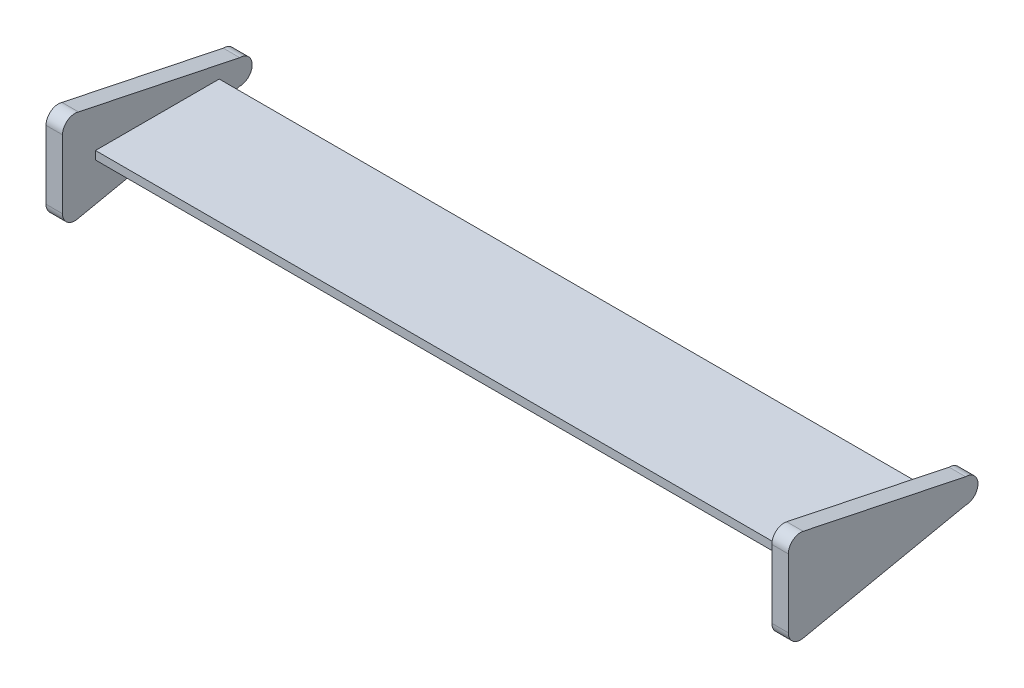
ISO-10303-21;
HEADER;
FILE_DESCRIPTION(('STEP AP214'),'2;1');
FILE_NAME('part.step','',(''),(''),'','','');
FILE_SCHEMA(('AUTOMOTIVE_DESIGN { 1 0 10303 214 1 1 1 1 }'));
ENDSEC;
DATA;
#1=APPLICATION_CONTEXT('core data for automotive mechanical design processes');
#2=APPLICATION_PROTOCOL_DEFINITION('international standard','automotive_design',2000,#1);
#3=PRODUCT_CONTEXT('',#1,'mechanical');
#4=PRODUCT('Part','Part','',(#3));
#5=PRODUCT_RELATED_PRODUCT_CATEGORY('part','',(#4));
#6=PRODUCT_DEFINITION_FORMATION('','',#4);
#7=PRODUCT_DEFINITION_CONTEXT('part definition',#1,'design');
#8=PRODUCT_DEFINITION('design','',#6,#7);
#9=PRODUCT_DEFINITION_SHAPE('','',#8);
#10=(LENGTH_UNIT() NAMED_UNIT(*) SI_UNIT(.MILLI.,.METRE.));
#11=(NAMED_UNIT(*) PLANE_ANGLE_UNIT() SI_UNIT($,.RADIAN.));
#12=(NAMED_UNIT(*) SI_UNIT($,.STERADIAN.) SOLID_ANGLE_UNIT());
#13=UNCERTAINTY_MEASURE_WITH_UNIT(LENGTH_MEASURE(1.E-05),#10,'distance_accuracy_value','');
#14=(GEOMETRIC_REPRESENTATION_CONTEXT(3) GLOBAL_UNCERTAINTY_ASSIGNED_CONTEXT((#13)) GLOBAL_UNIT_ASSIGNED_CONTEXT((#10,
#11,#12)) REPRESENTATION_CONTEXT('',''));
#15=CARTESIAN_POINT('',(0.,0.,0.));
#16=DIRECTION('',(0.,0.,1.));
#17=DIRECTION('',(1.,0.,0.));
#18=AXIS2_PLACEMENT_3D('',#15,#16,#17);
#19=CARTESIAN_POINT('',(-45.,0.5,-7.5));
#20=DIRECTION('',(0.,0.,1.));
#21=DIRECTION('',(1.,0.,0.));
#22=AXIS2_PLACEMENT_3D('',#19,#20,#21);
#23=PLANE('',#22);
#24=DIRECTION('',(0.,-1.,0.));
#25=VECTOR('',#24,1.);
#26=CARTESIAN_POINT('',(-43.,0.5,-7.5));
#27=LINE('',#26,#25);
#28=CARTESIAN_POINT('',(-43.,0.5,-7.5));
#29=VERTEX_POINT('',#28);
#30=CARTESIAN_POINT('',(-43.,-0.5,-7.5));
#31=VERTEX_POINT('',#30);
#32=EDGE_CURVE('E341',#29,#31,#27,.T.);
#33=ORIENTED_EDGE('',*,*,#32,.F.);
#34=DIRECTION('',(-1.,0.,0.));
#35=VECTOR('',#34,1.);
#36=CARTESIAN_POINT('',(-45.,0.5,-7.5));
#37=LINE('',#36,#35);
#38=CARTESIAN_POINT('',(43.,0.5,-7.5));
#39=VERTEX_POINT('',#38);
#40=EDGE_CURVE('E426',#39,#29,#37,.T.);
#41=ORIENTED_EDGE('',*,*,#40,.F.);
#42=DIRECTION('',(0.,1.,0.));
#43=VECTOR('',#42,1.);
#44=CARTESIAN_POINT('',(43.,0.5,-7.5));
#45=LINE('',#44,#43);
#46=CARTESIAN_POINT('',(43.,-0.5,-7.5));
#47=VERTEX_POINT('',#46);
#48=EDGE_CURVE('E418',#47,#39,#45,.T.);
#49=ORIENTED_EDGE('',*,*,#48,.F.);
#50=DIRECTION('',(-1.,0.,0.));
#51=VECTOR('',#50,1.);
#52=CARTESIAN_POINT('',(-45.,-0.5,-7.5));
#53=LINE('',#52,#51);
#54=EDGE_CURVE('E425',#47,#31,#53,.T.);
#55=ORIENTED_EDGE('',*,*,#54,.T.);
#56=EDGE_LOOP('',(#33,#41,#49,#55));
#57=FACE_BOUND('',#56,.T.);
#58=ADVANCED_FACE('F42',(#57),#23,.F.);
#59=CARTESIAN_POINT('',(-45.,0.5,7.5));
#60=DIRECTION('',(0.,0.,-1.));
#61=DIRECTION('',(-1.,0.,0.));
#62=AXIS2_PLACEMENT_3D('',#59,#60,#61);
#63=PLANE('',#62);
#64=DIRECTION('',(0.,1.,0.));
#65=VECTOR('',#64,1.);
#66=CARTESIAN_POINT('',(-43.,0.5,7.5));
#67=LINE('',#66,#65);
#68=CARTESIAN_POINT('',(-43.,-0.5,7.5));
#69=VERTEX_POINT('',#68);
#70=CARTESIAN_POINT('',(-43.,0.5,7.5));
#71=VERTEX_POINT('',#70);
#72=EDGE_CURVE('E323',#69,#71,#67,.T.);
#73=ORIENTED_EDGE('',*,*,#72,.F.);
#74=DIRECTION('',(1.,0.,0.));
#75=VECTOR('',#74,1.);
#76=CARTESIAN_POINT('',(-45.,-0.5,7.5));
#77=LINE('',#76,#75);
#78=CARTESIAN_POINT('',(43.,-0.5,7.5));
#79=VERTEX_POINT('',#78);
#80=EDGE_CURVE('E431',#69,#79,#77,.T.);
#81=ORIENTED_EDGE('',*,*,#80,.T.);
#82=DIRECTION('',(0.,-1.,0.));
#83=VECTOR('',#82,1.);
#84=CARTESIAN_POINT('',(43.,0.5,7.5));
#85=LINE('',#84,#83);
#86=CARTESIAN_POINT('',(43.,0.5,7.5));
#87=VERTEX_POINT('',#86);
#88=EDGE_CURVE('E400',#87,#79,#85,.T.);
#89=ORIENTED_EDGE('',*,*,#88,.F.);
#90=DIRECTION('',(1.,0.,0.));
#91=VECTOR('',#90,1.);
#92=CARTESIAN_POINT('',(-45.,0.5,7.5));
#93=LINE('',#92,#91);
#94=EDGE_CURVE('E430',#71,#87,#93,.T.);
#95=ORIENTED_EDGE('',*,*,#94,.F.);
#96=EDGE_LOOP('',(#73,#81,#89,#95));
#97=FACE_BOUND('',#96,.T.);
#98=ADVANCED_FACE('F487',(#97),#63,.F.);
#99=CARTESIAN_POINT('',(0.,0.5,0.));
#100=DIRECTION('',(0.,1.,0.));
#101=DIRECTION('',(0.,0.,1.));
#102=AXIS2_PLACEMENT_3D('',#99,#100,#101);
#103=PLANE('',#102);
#104=ORIENTED_EDGE('',*,*,#40,.T.);
#105=DIRECTION('',(0.,0.,1.));
#106=VECTOR('',#105,1.);
#107=CARTESIAN_POINT('',(-43.,0.5,0.));
#108=LINE('',#107,#106);
#109=EDGE_CURVE('E345',#29,#71,#108,.T.);
#110=ORIENTED_EDGE('',*,*,#109,.T.);
#111=ORIENTED_EDGE('',*,*,#94,.T.);
#112=DIRECTION('',(0.,0.,-1.));
#113=VECTOR('',#112,1.);
#114=CARTESIAN_POINT('',(43.,0.5,0.));
#115=LINE('',#114,#113);
#116=EDGE_CURVE('E422',#87,#39,#115,.T.);
#117=ORIENTED_EDGE('',*,*,#116,.T.);
#118=EDGE_LOOP('',(#104,#110,#111,#117));
#119=FACE_BOUND('',#118,.T.);
#120=ADVANCED_FACE('F492',(#119),#103,.T.);
#121=CARTESIAN_POINT('',(0.,-0.5,0.));
#122=DIRECTION('',(0.,1.,0.));
#123=DIRECTION('',(0.,0.,1.));
#124=AXIS2_PLACEMENT_3D('',#121,#122,#123);
#125=PLANE('',#124);
#126=DIRECTION('',(1.,0.,0.));
#127=VECTOR('',#126,1.);
#128=CARTESIAN_POINT('',(0.,-0.5,1.5));
#129=LINE('',#128,#127);
#130=CARTESIAN_POINT('',(-15.,-0.5,1.5));
#131=VERTEX_POINT('',#130);
#132=CARTESIAN_POINT('',(-12.,-0.5,1.5));
#133=VERTEX_POINT('',#132);
#134=EDGE_CURVE('E463',#131,#133,#129,.T.);
#135=ORIENTED_EDGE('',*,*,#134,.T.);
#136=DIRECTION('',(0.,0.,-1.));
#137=VECTOR('',#136,1.);
#138=CARTESIAN_POINT('',(-12.,-0.5,0.));
#139=LINE('',#138,#137);
#140=CARTESIAN_POINT('',(-12.,-0.5,-1.5));
#141=VERTEX_POINT('',#140);
#142=EDGE_CURVE('E11',#133,#141,#139,.T.);
#143=ORIENTED_EDGE('',*,*,#142,.T.);
#144=DIRECTION('',(-1.,0.,0.));
#145=VECTOR('',#144,1.);
#146=CARTESIAN_POINT('',(0.,-0.5,-1.5));
#147=LINE('',#146,#145);
#148=CARTESIAN_POINT('',(-15.,-0.5,-1.5));
#149=VERTEX_POINT('',#148);
#150=EDGE_CURVE('E51',#141,#149,#147,.T.);
#151=ORIENTED_EDGE('',*,*,#150,.T.);
#152=DIRECTION('',(0.,0.,1.));
#153=VECTOR('',#152,1.);
#154=CARTESIAN_POINT('',(-15.,-0.5,0.));
#155=LINE('',#154,#153);
#156=EDGE_CURVE('E466',#149,#131,#155,.T.);
#157=ORIENTED_EDGE('',*,*,#156,.T.);
#158=EDGE_LOOP('',(#135,#143,#151,#157));
#159=FACE_BOUND('',#158,.T.);
#160=DIRECTION('',(0.,0.,-1.));
#161=VECTOR('',#160,1.);
#162=CARTESIAN_POINT('',(15.,-0.5,0.));
#163=LINE('',#162,#161);
#164=CARTESIAN_POINT('',(15.,-0.5,1.5));
#165=VERTEX_POINT('',#164);
#166=CARTESIAN_POINT('',(15.,-0.5,-1.5));
#167=VERTEX_POINT('',#166);
#168=EDGE_CURVE('E447',#165,#167,#163,.T.);
#169=ORIENTED_EDGE('',*,*,#168,.T.);
#170=DIRECTION('',(-1.,0.,0.));
#171=VECTOR('',#170,1.);
#172=CARTESIAN_POINT('',(0.,-0.5,-1.5));
#173=LINE('',#172,#171);
#174=CARTESIAN_POINT('',(12.,-0.5,-1.5));
#175=VERTEX_POINT('',#174);
#176=EDGE_CURVE('E459',#167,#175,#173,.T.);
#177=ORIENTED_EDGE('',*,*,#176,.T.);
#178=DIRECTION('',(0.,0.,1.));
#179=VECTOR('',#178,1.);
#180=CARTESIAN_POINT('',(12.,-0.5,0.));
#181=LINE('',#180,#179);
#182=CARTESIAN_POINT('',(12.,-0.5,1.5));
#183=VERTEX_POINT('',#182);
#184=EDGE_CURVE('E455',#175,#183,#181,.T.);
#185=ORIENTED_EDGE('',*,*,#184,.T.);
#186=DIRECTION('',(1.,0.,0.));
#187=VECTOR('',#186,1.);
#188=CARTESIAN_POINT('',(0.,-0.5,1.5));
#189=LINE('',#188,#187);
#190=EDGE_CURVE('E451',#183,#165,#189,.T.);
#191=ORIENTED_EDGE('',*,*,#190,.T.);
#192=EDGE_LOOP('',(#169,#177,#185,#191));
#193=FACE_BOUND('',#192,.T.);
#194=DIRECTION('',(0.,0.,1.));
#195=VECTOR('',#194,1.);
#196=CARTESIAN_POINT('',(-43.,-0.5,0.));
#197=LINE('',#196,#195);
#198=EDGE_CURVE('E443',#31,#69,#197,.T.);
#199=ORIENTED_EDGE('',*,*,#198,.F.);
#200=ORIENTED_EDGE('',*,*,#54,.F.);
#201=DIRECTION('',(0.,0.,-1.));
#202=VECTOR('',#201,1.);
#203=CARTESIAN_POINT('',(43.,-0.5,0.));
#204=LINE('',#203,#202);
#205=EDGE_CURVE('E434',#79,#47,#204,.T.);
#206=ORIENTED_EDGE('',*,*,#205,.F.);
#207=ORIENTED_EDGE('',*,*,#80,.F.);
#208=EDGE_LOOP('',(#199,#200,#206,#207));
#209=FACE_BOUND('',#208,.T.);
#210=ADVANCED_FACE('F472',(#159,#193,#209),#125,.F.);
#211=CARTESIAN_POINT('',(43.,4.14213562373104,10.));
#212=DIRECTION('',(1.,0.,0.));
#213=DIRECTION('',(0.,0.,-1.));
#214=AXIS2_PLACEMENT_3D('',#211,#212,#213);
#215=CYLINDRICAL_SURFACE('',#214,1.5);
#216=CARTESIAN_POINT('',(45.,4.14213562373104,10.));
#217=DIRECTION('',(1.,0.,0.));
#218=DIRECTION('',(0.,0.,-1.));
#219=AXIS2_PLACEMENT_3D('',#216,#217,#218);
#220=CIRCLE('',#219,1.5);
#221=CARTESIAN_POINT('',(45.,5.61049188842883,9.69352018023567));
#222=VERTEX_POINT('',#221);
#223=CARTESIAN_POINT('',(45.,4.14213562373103,11.5));
#224=VERTEX_POINT('',#223);
#225=EDGE_CURVE('E348',#222,#224,#220,.T.);
#226=ORIENTED_EDGE('',*,*,#225,.F.);
#227=DIRECTION('',(1.,0.,0.));
#228=VECTOR('',#227,1.);
#229=CARTESIAN_POINT('',(43.,5.61049188842883,9.69352018023567));
#230=LINE('',#229,#228);
#231=CARTESIAN_POINT('',(43.,5.61049188842883,9.69352018023567));
#232=VERTEX_POINT('',#231);
#233=EDGE_CURVE('E397',#232,#222,#230,.T.);
#234=ORIENTED_EDGE('',*,*,#233,.F.);
#235=CARTESIAN_POINT('',(43.,4.14213562373104,10.));
#236=DIRECTION('',(1.,0.,0.));
#237=DIRECTION('',(0.,0.,-1.));
#238=AXIS2_PLACEMENT_3D('',#235,#236,#237);
#239=CIRCLE('',#238,1.5);
#240=CARTESIAN_POINT('',(43.,4.14213562373103,11.5));
#241=VERTEX_POINT('',#240);
#242=EDGE_CURVE('E349',#232,#241,#239,.T.);
#243=ORIENTED_EDGE('',*,*,#242,.T.);
#244=DIRECTION('',(1.,0.,0.));
#245=VECTOR('',#244,1.);
#246=CARTESIAN_POINT('',(43.,4.14213562373103,11.5));
#247=LINE('',#246,#245);
#248=EDGE_CURVE('E374',#241,#224,#247,.T.);
#249=ORIENTED_EDGE('',*,*,#248,.T.);
#250=EDGE_LOOP('',(#226,#234,#243,#249));
#251=FACE_BOUND('',#250,.T.);
#252=ADVANCED_FACE('F504',(#251),#215,.T.);
#253=CARTESIAN_POINT('',(43.,5.61049188842883,9.69352018023567));
#254=DIRECTION('',(0.,0.978904176465188,-0.204319879842889));
#255=DIRECTION('',(0.,0.204319879842889,0.978904176465188));
#256=AXIS2_PLACEMENT_3D('',#253,#254,#255);
#257=PLANE('',#256);
#258=DIRECTION('',(0.,0.204319879842889,0.978904176465188));
#259=VECTOR('',#258,1.);
#260=CARTESIAN_POINT('',(45.,5.61049188842883,9.69352018023567));
#261=LINE('',#260,#259);
#262=CARTESIAN_POINT('',(45.,1.5,-10.));
#263=VERTEX_POINT('',#262);
#264=EDGE_CURVE('E354',#263,#222,#261,.T.);
#265=ORIENTED_EDGE('',*,*,#264,.F.);
#266=DIRECTION('',(1.,0.,0.));
#267=VECTOR('',#266,1.);
#268=CARTESIAN_POINT('',(43.,1.5,-10.));
#269=LINE('',#268,#267);
#270=CARTESIAN_POINT('',(43.,1.5,-10.));
#271=VERTEX_POINT('',#270);
#272=EDGE_CURVE('E401',#271,#263,#269,.T.);
#273=ORIENTED_EDGE('',*,*,#272,.F.);
#274=DIRECTION('',(0.,0.204319879842889,0.978904176465188));
#275=VECTOR('',#274,1.);
#276=CARTESIAN_POINT('',(43.,5.61049188842883,9.69352018023567));
#277=LINE('',#276,#275);
#278=EDGE_CURVE('E370',#271,#232,#277,.T.);
#279=ORIENTED_EDGE('',*,*,#278,.T.);
#280=ORIENTED_EDGE('',*,*,#233,.T.);
#281=EDGE_LOOP('',(#265,#273,#279,#280));
#282=FACE_BOUND('',#281,.T.);
#283=ADVANCED_FACE('F510',(#282),#257,.T.);
#284=CARTESIAN_POINT('',(43.,0.,-10.));
#285=DIRECTION('',(1.,0.,0.));
#286=DIRECTION('',(0.,0.,-1.));
#287=AXIS2_PLACEMENT_3D('',#284,#285,#286);
#288=CYLINDRICAL_SURFACE('',#287,1.5);
#289=CARTESIAN_POINT('',(45.,0.,-10.));
#290=DIRECTION('',(1.,0.,0.));
#291=DIRECTION('',(0.,0.,-1.));
#292=AXIS2_PLACEMENT_3D('',#289,#290,#291);
#293=CIRCLE('',#292,1.5);
#294=CARTESIAN_POINT('',(45.,-1.5,-10.));
#295=VERTEX_POINT('',#294);
#296=EDGE_CURVE('E390',#295,#263,#293,.T.);
#297=ORIENTED_EDGE('',*,*,#296,.F.);
#298=DIRECTION('',(1.,0.,0.));
#299=VECTOR('',#298,1.);
#300=CARTESIAN_POINT('',(43.,-1.5,-10.));
#301=LINE('',#300,#299);
#302=CARTESIAN_POINT('',(43.,-1.5,-10.));
#303=VERTEX_POINT('',#302);
#304=EDGE_CURVE('E404',#303,#295,#301,.T.);
#305=ORIENTED_EDGE('',*,*,#304,.F.);
#306=CARTESIAN_POINT('',(43.,0.,-10.));
#307=DIRECTION('',(1.,0.,0.));
#308=DIRECTION('',(0.,0.,-1.));
#309=AXIS2_PLACEMENT_3D('',#306,#307,#308);
#310=CIRCLE('',#309,1.5);
#311=EDGE_CURVE('E366',#303,#271,#310,.T.);
#312=ORIENTED_EDGE('',*,*,#311,.T.);
#313=ORIENTED_EDGE('',*,*,#272,.T.);
#314=EDGE_LOOP('',(#297,#305,#312,#313));
#315=FACE_BOUND('',#314,.T.);
#316=ADVANCED_FACE('F524',(#315),#288,.T.);
#317=CARTESIAN_POINT('',(43.,-1.5,-10.));
#318=DIRECTION('',(0.,-0.97890417646519,-0.204319879842881));
#319=DIRECTION('',(0.,0.204319879842881,-0.97890417646519));
#320=AXIS2_PLACEMENT_3D('',#317,#318,#319);
#321=PLANE('',#320);
#322=DIRECTION('',(0.,0.204319879842881,-0.978904176465189));
#323=VECTOR('',#322,1.);
#324=CARTESIAN_POINT('',(45.,-1.5,-10.));
#325=LINE('',#324,#323);
#326=CARTESIAN_POINT('',(45.,-5.61049188842866,9.69352018023567));
#327=VERTEX_POINT('',#326);
#328=EDGE_CURVE('E386',#327,#295,#325,.T.);
#329=ORIENTED_EDGE('',*,*,#328,.F.);
#330=DIRECTION('',(1.,0.,0.));
#331=VECTOR('',#330,1.);
#332=CARTESIAN_POINT('',(43.,-5.61049188842866,9.69352018023567));
#333=LINE('',#332,#331);
#334=CARTESIAN_POINT('',(43.,-5.61049188842866,9.69352018023567));
#335=VERTEX_POINT('',#334);
#336=EDGE_CURVE('E407',#335,#327,#333,.T.);
#337=ORIENTED_EDGE('',*,*,#336,.F.);
#338=DIRECTION('',(0.,0.204319879842881,-0.978904176465189));
#339=VECTOR('',#338,1.);
#340=CARTESIAN_POINT('',(43.,-1.5,-10.));
#341=LINE('',#340,#339);
#342=EDGE_CURVE('E362',#335,#303,#341,.T.);
#343=ORIENTED_EDGE('',*,*,#342,.T.);
#344=ORIENTED_EDGE('',*,*,#304,.T.);
#345=EDGE_LOOP('',(#329,#337,#343,#344));
#346=FACE_BOUND('',#345,.T.);
#347=ADVANCED_FACE('F520',(#346),#321,.T.);
#348=CARTESIAN_POINT('',(43.,-4.14213562373088,10.));
#349=DIRECTION('',(1.,0.,0.));
#350=DIRECTION('',(0.,0.,-1.));
#351=AXIS2_PLACEMENT_3D('',#348,#349,#350);
#352=CYLINDRICAL_SURFACE('',#351,1.5);
#353=CARTESIAN_POINT('',(45.,-4.14213562373088,10.));
#354=DIRECTION('',(1.,0.,0.));
#355=DIRECTION('',(0.,0.,-1.));
#356=AXIS2_PLACEMENT_3D('',#353,#354,#355);
#357=CIRCLE('',#356,1.5);
#358=CARTESIAN_POINT('',(45.,-4.14213562373089,11.5));
#359=VERTEX_POINT('',#358);
#360=EDGE_CURVE('E382',#359,#327,#357,.T.);
#361=ORIENTED_EDGE('',*,*,#360,.F.);
#362=DIRECTION('',(1.,0.,0.));
#363=VECTOR('',#362,1.);
#364=CARTESIAN_POINT('',(43.,-4.14213562373089,11.5));
#365=LINE('',#364,#363);
#366=CARTESIAN_POINT('',(43.,-4.14213562373089,11.5));
#367=VERTEX_POINT('',#366);
#368=EDGE_CURVE('E410',#367,#359,#365,.T.);
#369=ORIENTED_EDGE('',*,*,#368,.F.);
#370=CARTESIAN_POINT('',(43.,-4.14213562373088,10.));
#371=DIRECTION('',(1.,0.,0.));
#372=DIRECTION('',(0.,0.,-1.));
#373=AXIS2_PLACEMENT_3D('',#370,#371,#372);
#374=CIRCLE('',#373,1.5);
#375=EDGE_CURVE('E358',#367,#335,#374,.T.);
#376=ORIENTED_EDGE('',*,*,#375,.T.);
#377=ORIENTED_EDGE('',*,*,#336,.T.);
#378=EDGE_LOOP('',(#361,#369,#376,#377));
#379=FACE_BOUND('',#378,.T.);
#380=ADVANCED_FACE('F516',(#379),#352,.T.);
#381=CARTESIAN_POINT('',(43.,4.14213562373103,11.5));
#382=DIRECTION('',(0.,0.,1.));
#383=DIRECTION('',(0.,-1.,0.));
#384=AXIS2_PLACEMENT_3D('',#381,#382,#383);
#385=PLANE('',#384);
#386=DIRECTION('',(0.,-1.,0.));
#387=VECTOR('',#386,1.);
#388=CARTESIAN_POINT('',(45.,4.14213562373103,11.5));
#389=LINE('',#388,#387);
#390=EDGE_CURVE('E378',#224,#359,#389,.T.);
#391=ORIENTED_EDGE('',*,*,#390,.F.);
#392=ORIENTED_EDGE('',*,*,#248,.F.);
#393=DIRECTION('',(0.,-1.,0.));
#394=VECTOR('',#393,1.);
#395=CARTESIAN_POINT('',(43.,4.14213562373103,11.5));
#396=LINE('',#395,#394);
#397=EDGE_CURVE('E353',#241,#367,#396,.T.);
#398=ORIENTED_EDGE('',*,*,#397,.T.);
#399=ORIENTED_EDGE('',*,*,#368,.T.);
#400=EDGE_LOOP('',(#391,#392,#398,#399));
#401=FACE_BOUND('',#400,.T.);
#402=ADVANCED_FACE('F512',(#401),#385,.T.);
#403=CARTESIAN_POINT('',(43.,4.14213562373104,10.));
#404=DIRECTION('',(1.,0.,0.));
#405=DIRECTION('',(0.,0.,-1.));
#406=AXIS2_PLACEMENT_3D('',#403,#404,#405);
#407=PLANE('',#406);
#408=ORIENTED_EDGE('',*,*,#116,.F.);
#409=ORIENTED_EDGE('',*,*,#88,.T.);
#410=ORIENTED_EDGE('',*,*,#205,.T.);
#411=ORIENTED_EDGE('',*,*,#48,.T.);
#412=EDGE_LOOP('',(#408,#409,#410,#411));
#413=FACE_BOUND('',#412,.T.);
#414=ORIENTED_EDGE('',*,*,#242,.F.);
#415=ORIENTED_EDGE('',*,*,#278,.F.);
#416=ORIENTED_EDGE('',*,*,#311,.F.);
#417=ORIENTED_EDGE('',*,*,#342,.F.);
#418=ORIENTED_EDGE('',*,*,#375,.F.);
#419=ORIENTED_EDGE('',*,*,#397,.F.);
#420=EDGE_LOOP('',(#414,#415,#416,#417,#418,#419));
#421=FACE_BOUND('',#420,.T.);
#422=ADVANCED_FACE('F515',(#413,#421),#407,.F.);
#423=CARTESIAN_POINT('',(45.,0.5,-7.5));
#424=DIRECTION('',(-1.,0.,0.));
#425=DIRECTION('',(0.,0.,1.));
#426=AXIS2_PLACEMENT_3D('',#423,#424,#425);
#427=PLANE('',#426);
#428=ORIENTED_EDGE('',*,*,#225,.T.);
#429=ORIENTED_EDGE('',*,*,#390,.T.);
#430=ORIENTED_EDGE('',*,*,#360,.T.);
#431=ORIENTED_EDGE('',*,*,#328,.T.);
#432=ORIENTED_EDGE('',*,*,#296,.T.);
#433=ORIENTED_EDGE('',*,*,#264,.T.);
#434=EDGE_LOOP('',(#428,#429,#430,#431,#432,#433));
#435=FACE_BOUND('',#434,.T.);
#436=ADVANCED_FACE('F44',(#435),#427,.F.);
#437=CARTESIAN_POINT('',(-43.,0.,-10.));
#438=DIRECTION('',(-1.,0.,0.));
#439=DIRECTION('',(0.,0.,1.));
#440=AXIS2_PLACEMENT_3D('',#437,#438,#439);
#441=CYLINDRICAL_SURFACE('',#440,1.5);
#442=CARTESIAN_POINT('',(-45.,0.,-10.));
#443=DIRECTION('',(-1.,0.,0.));
#444=DIRECTION('',(0.,0.,1.));
#445=AXIS2_PLACEMENT_3D('',#442,#443,#444);
#446=CIRCLE('',#445,1.5);
#447=CARTESIAN_POINT('',(-45.,1.5,-10.));
#448=VERTEX_POINT('',#447);
#449=CARTESIAN_POINT('',(-45.,-1.5,-10.));
#450=VERTEX_POINT('',#449);
#451=EDGE_CURVE('E240',#448,#450,#446,.T.);
#452=ORIENTED_EDGE('',*,*,#451,.F.);
#453=DIRECTION('',(-1.,0.,0.));
#454=VECTOR('',#453,1.);
#455=CARTESIAN_POINT('',(-43.,1.5,-10.));
#456=LINE('',#455,#454);
#457=CARTESIAN_POINT('',(-43.,1.5,-10.));
#458=VERTEX_POINT('',#457);
#459=EDGE_CURVE('E320',#458,#448,#456,.T.);
#460=ORIENTED_EDGE('',*,*,#459,.F.);
#461=CARTESIAN_POINT('',(-43.,0.,-10.));
#462=DIRECTION('',(-1.,0.,0.));
#463=DIRECTION('',(0.,0.,1.));
#464=AXIS2_PLACEMENT_3D('',#461,#462,#463);
#465=CIRCLE('',#464,1.5);
#466=CARTESIAN_POINT('',(-43.,-1.5,-10.));
#467=VERTEX_POINT('',#466);
#468=EDGE_CURVE('E272',#458,#467,#465,.T.);
#469=ORIENTED_EDGE('',*,*,#468,.T.);
#470=DIRECTION('',(-1.,0.,0.));
#471=VECTOR('',#470,1.);
#472=CARTESIAN_POINT('',(-43.,-1.5,-10.));
#473=LINE('',#472,#471);
#474=EDGE_CURVE('E297',#467,#450,#473,.T.);
#475=ORIENTED_EDGE('',*,*,#474,.T.);
#476=EDGE_LOOP('',(#452,#460,#469,#475));
#477=FACE_BOUND('',#476,.T.);
#478=ADVANCED_FACE('F535',(#477),#441,.T.);
#479=CARTESIAN_POINT('',(-43.,1.5,-10.));
#480=DIRECTION('',(0.,0.978975416046563,-0.203978270353633));
#481=DIRECTION('',(0.,0.203978270353633,0.978975416046562));
#482=AXIS2_PLACEMENT_3D('',#479,#480,#481);
#483=PLANE('',#482);
#484=DIRECTION('',(0.,-0.203978270353633,-0.978975416046562));
#485=VECTOR('',#484,1.);
#486=CARTESIAN_POINT('',(-45.,1.5,-10.));
#487=LINE('',#486,#485);
#488=CARTESIAN_POINT('',(-45.,5.57415826096195,9.55355720807899));
#489=VERTEX_POINT('',#488);
#490=EDGE_CURVE('E277',#489,#448,#487,.T.);
#491=ORIENTED_EDGE('',*,*,#490,.F.);
#492=DIRECTION('',(-1.,0.,0.));
#493=VECTOR('',#492,1.);
#494=CARTESIAN_POINT('',(-43.,5.57415826096195,9.55355720807899));
#495=LINE('',#494,#493);
#496=CARTESIAN_POINT('',(-43.,5.57415826096195,9.55355720807899));
#497=VERTEX_POINT('',#496);
#498=EDGE_CURVE('E324',#497,#489,#495,.T.);
#499=ORIENTED_EDGE('',*,*,#498,.F.);
#500=DIRECTION('',(0.,-0.203978270353633,-0.978975416046562));
#501=VECTOR('',#500,1.);
#502=CARTESIAN_POINT('',(-43.,1.5,-10.));
#503=LINE('',#502,#501);
#504=EDGE_CURVE('E293',#497,#458,#503,.T.);
#505=ORIENTED_EDGE('',*,*,#504,.T.);
#506=ORIENTED_EDGE('',*,*,#459,.T.);
#507=EDGE_LOOP('',(#491,#499,#505,#506));
#508=FACE_BOUND('',#507,.T.);
#509=ADVANCED_FACE('F538',(#508),#483,.T.);
#510=CARTESIAN_POINT('',(-43.,4.14213562373104,10.));
#511=DIRECTION('',(-1.,0.,0.));
#512=DIRECTION('',(0.,0.,1.));
#513=AXIS2_PLACEMENT_3D('',#510,#511,#512);
#514=CYLINDRICAL_SURFACE('',#513,1.5);
#515=CARTESIAN_POINT('',(-45.,4.14213562373104,10.));
#516=DIRECTION('',(-1.,0.,0.));
#517=DIRECTION('',(0.,0.,1.));
#518=AXIS2_PLACEMENT_3D('',#515,#516,#517);
#519=CIRCLE('',#518,1.5);
#520=CARTESIAN_POINT('',(-45.,4.14213562373104,11.5));
#521=VERTEX_POINT('',#520);
#522=EDGE_CURVE('E313',#521,#489,#519,.T.);
#523=ORIENTED_EDGE('',*,*,#522,.F.);
#524=DIRECTION('',(-1.,0.,0.));
#525=VECTOR('',#524,1.);
#526=CARTESIAN_POINT('',(-43.,4.14213562373104,11.5));
#527=LINE('',#526,#525);
#528=CARTESIAN_POINT('',(-43.,4.14213562373104,11.5));
#529=VERTEX_POINT('',#528);
#530=EDGE_CURVE('E327',#529,#521,#527,.T.);
#531=ORIENTED_EDGE('',*,*,#530,.F.);
#532=CARTESIAN_POINT('',(-43.,4.14213562373104,10.));
#533=DIRECTION('',(-1.,0.,0.));
#534=DIRECTION('',(0.,0.,1.));
#535=AXIS2_PLACEMENT_3D('',#532,#533,#534);
#536=CIRCLE('',#535,1.5);
#537=EDGE_CURVE('E289',#529,#497,#536,.T.);
#538=ORIENTED_EDGE('',*,*,#537,.T.);
#539=ORIENTED_EDGE('',*,*,#498,.T.);
#540=EDGE_LOOP('',(#523,#531,#538,#539));
#541=FACE_BOUND('',#540,.T.);
#542=ADVANCED_FACE('F551',(#541),#514,.T.);
#543=CARTESIAN_POINT('',(-43.,4.14213562373104,11.5));
#544=DIRECTION('',(0.,0.,1.));
#545=DIRECTION('',(0.,-1.,0.));
#546=AXIS2_PLACEMENT_3D('',#543,#544,#545);
#547=PLANE('',#546);
#548=DIRECTION('',(0.,1.,0.));
#549=VECTOR('',#548,1.);
#550=CARTESIAN_POINT('',(-45.,4.14213562373104,11.5));
#551=LINE('',#550,#549);
#552=CARTESIAN_POINT('',(-45.,-4.14213562373088,11.5));
#553=VERTEX_POINT('',#552);
#554=EDGE_CURVE('E309',#553,#521,#551,.T.);
#555=ORIENTED_EDGE('',*,*,#554,.F.);
#556=DIRECTION('',(-1.,0.,0.));
#557=VECTOR('',#556,1.);
#558=CARTESIAN_POINT('',(-43.,-4.14213562373088,11.5));
#559=LINE('',#558,#557);
#560=CARTESIAN_POINT('',(-43.,-4.14213562373088,11.5));
#561=VERTEX_POINT('',#560);
#562=EDGE_CURVE('E330',#561,#553,#559,.T.);
#563=ORIENTED_EDGE('',*,*,#562,.F.);
#564=DIRECTION('',(0.,1.,0.));
#565=VECTOR('',#564,1.);
#566=CARTESIAN_POINT('',(-43.,4.14213562373104,11.5));
#567=LINE('',#566,#565);
#568=EDGE_CURVE('E285',#561,#529,#567,.T.);
#569=ORIENTED_EDGE('',*,*,#568,.T.);
#570=ORIENTED_EDGE('',*,*,#530,.T.);
#571=EDGE_LOOP('',(#555,#563,#569,#570));
#572=FACE_BOUND('',#571,.T.);
#573=ADVANCED_FACE('F547',(#572),#547,.T.);
#574=CARTESIAN_POINT('',(-43.,-4.14213562373088,10.));
#575=DIRECTION('',(-1.,0.,0.));
#576=DIRECTION('',(0.,0.,1.));
#577=AXIS2_PLACEMENT_3D('',#574,#575,#576);
#578=CYLINDRICAL_SURFACE('',#577,1.5);
#579=CARTESIAN_POINT('',(-45.,-4.14213562373088,10.));
#580=DIRECTION('',(-1.,0.,0.));
#581=DIRECTION('',(0.,0.,1.));
#582=AXIS2_PLACEMENT_3D('',#579,#580,#581);
#583=CIRCLE('',#582,1.5);
#584=CARTESIAN_POINT('',(-45.,-5.57415826096179,9.55355720807899));
#585=VERTEX_POINT('',#584);
#586=EDGE_CURVE('E305',#585,#553,#583,.T.);
#587=ORIENTED_EDGE('',*,*,#586,.F.);
#588=DIRECTION('',(-1.,0.,0.));
#589=VECTOR('',#588,1.);
#590=CARTESIAN_POINT('',(-43.,-5.57415826096179,9.55355720807899));
#591=LINE('',#590,#589);
#592=CARTESIAN_POINT('',(-43.,-5.57415826096179,9.55355720807899));
#593=VERTEX_POINT('',#592);
#594=EDGE_CURVE('E333',#593,#585,#591,.T.);
#595=ORIENTED_EDGE('',*,*,#594,.F.);
#596=CARTESIAN_POINT('',(-43.,-4.14213562373088,10.));
#597=DIRECTION('',(-1.,0.,0.));
#598=DIRECTION('',(0.,0.,1.));
#599=AXIS2_PLACEMENT_3D('',#596,#597,#598);
#600=CIRCLE('',#599,1.5);
#601=EDGE_CURVE('E281',#593,#561,#600,.T.);
#602=ORIENTED_EDGE('',*,*,#601,.T.);
#603=ORIENTED_EDGE('',*,*,#562,.T.);
#604=EDGE_LOOP('',(#587,#595,#602,#603));
#605=FACE_BOUND('',#604,.T.);
#606=ADVANCED_FACE('F543',(#605),#578,.T.);
#607=CARTESIAN_POINT('',(-43.,-1.5,-10.));
#608=DIRECTION('',(0.,-0.978975416046564,-0.203978270353625));
#609=DIRECTION('',(0.,0.203978270353625,-0.978975416046564));
#610=AXIS2_PLACEMENT_3D('',#607,#608,#609);
#611=PLANE('',#610);
#612=DIRECTION('',(0.,-0.203978270353625,0.978975416046564));
#613=VECTOR('',#612,1.);
#614=CARTESIAN_POINT('',(-45.,-1.5,-10.));
#615=LINE('',#614,#613);
#616=EDGE_CURVE('E301',#450,#585,#615,.T.);
#617=ORIENTED_EDGE('',*,*,#616,.F.);
#618=ORIENTED_EDGE('',*,*,#474,.F.);
#619=DIRECTION('',(0.,-0.203978270353625,0.978975416046564));
#620=VECTOR('',#619,1.);
#621=CARTESIAN_POINT('',(-43.,-1.5,-10.));
#622=LINE('',#621,#620);
#623=EDGE_CURVE('E276',#467,#593,#622,.T.);
#624=ORIENTED_EDGE('',*,*,#623,.T.);
#625=ORIENTED_EDGE('',*,*,#594,.T.);
#626=EDGE_LOOP('',(#617,#618,#624,#625));
#627=FACE_BOUND('',#626,.T.);
#628=ADVANCED_FACE('F540',(#627),#611,.T.);
#629=CARTESIAN_POINT('',(-43.,0.,-10.));
#630=DIRECTION('',(-1.,0.,0.));
#631=DIRECTION('',(0.,0.,1.));
#632=AXIS2_PLACEMENT_3D('',#629,#630,#631);
#633=PLANE('',#632);
#634=ORIENTED_EDGE('',*,*,#109,.F.);
#635=ORIENTED_EDGE('',*,*,#32,.T.);
#636=ORIENTED_EDGE('',*,*,#198,.T.);
#637=ORIENTED_EDGE('',*,*,#72,.T.);
#638=EDGE_LOOP('',(#634,#635,#636,#637));
#639=FACE_BOUND('',#638,.T.);
#640=ORIENTED_EDGE('',*,*,#468,.F.);
#641=ORIENTED_EDGE('',*,*,#504,.F.);
#642=ORIENTED_EDGE('',*,*,#537,.F.);
#643=ORIENTED_EDGE('',*,*,#568,.F.);
#644=ORIENTED_EDGE('',*,*,#601,.F.);
#645=ORIENTED_EDGE('',*,*,#623,.F.);
#646=EDGE_LOOP('',(#640,#641,#642,#643,#644,#645));
#647=FACE_BOUND('',#646,.T.);
#648=ADVANCED_FACE('F499',(#639,#647),#633,.F.);
#649=CARTESIAN_POINT('',(-45.,0.5,-7.5));
#650=DIRECTION('',(1.,0.,0.));
#651=DIRECTION('',(0.,0.,-1.));
#652=AXIS2_PLACEMENT_3D('',#649,#650,#651);
#653=PLANE('',#652);
#654=ORIENTED_EDGE('',*,*,#451,.T.);
#655=ORIENTED_EDGE('',*,*,#616,.T.);
#656=ORIENTED_EDGE('',*,*,#586,.T.);
#657=ORIENTED_EDGE('',*,*,#554,.T.);
#658=ORIENTED_EDGE('',*,*,#522,.T.);
#659=ORIENTED_EDGE('',*,*,#490,.T.);
#660=EDGE_LOOP('',(#654,#655,#656,#657,#658,#659));
#661=FACE_BOUND('',#660,.T.);
#662=ADVANCED_FACE('F496',(#661),#653,.F.);
#663=CARTESIAN_POINT('',(12.,-0.25,-1.5));
#664=DIRECTION('',(0.,0.,-1.));
#665=DIRECTION('',(-1.,0.,0.));
#666=AXIS2_PLACEMENT_3D('',#663,#664,#665);
#667=PLANE('',#666);
#668=DIRECTION('',(0.,-1.,0.));
#669=VECTOR('',#668,1.);
#670=CARTESIAN_POINT('',(15.,-0.25,-1.5));
#671=LINE('',#670,#669);
#672=CARTESIAN_POINT('',(15.,-0.25,-1.5));
#673=VERTEX_POINT('',#672);
#674=EDGE_CURVE('E66',#673,#167,#671,.T.);
#675=ORIENTED_EDGE('',*,*,#674,.F.);
#676=DIRECTION('',(1.,0.,0.));
#677=VECTOR('',#676,1.);
#678=CARTESIAN_POINT('',(12.,-0.25,-1.5));
#679=LINE('',#678,#677);
#680=CARTESIAN_POINT('',(12.,-0.25,-1.5));
#681=VERTEX_POINT('',#680);
#682=EDGE_CURVE('E226',#681,#673,#679,.T.);
#683=ORIENTED_EDGE('',*,*,#682,.F.);
#684=DIRECTION('',(0.,-1.,0.));
#685=VECTOR('',#684,1.);
#686=CARTESIAN_POINT('',(12.,-0.25,-1.5));
#687=LINE('',#686,#685);
#688=EDGE_CURVE('E258',#681,#175,#687,.T.);
#689=ORIENTED_EDGE('',*,*,#688,.T.);
#690=ORIENTED_EDGE('',*,*,#176,.F.);
#691=EDGE_LOOP('',(#675,#683,#689,#690));
#692=FACE_BOUND('',#691,.T.);
#693=ADVANCED_FACE('F498',(#692),#667,.F.);
#694=CARTESIAN_POINT('',(12.,-0.25,1.5));
#695=DIRECTION('',(-1.,0.,0.));
#696=DIRECTION('',(0.,0.,1.));
#697=AXIS2_PLACEMENT_3D('',#694,#695,#696);
#698=PLANE('',#697);
#699=ORIENTED_EDGE('',*,*,#688,.F.);
#700=DIRECTION('',(0.,0.,-1.));
#701=VECTOR('',#700,1.);
#702=CARTESIAN_POINT('',(12.,-0.25,1.5));
#703=LINE('',#702,#701);
#704=CARTESIAN_POINT('',(12.,-0.25,1.5));
#705=VERTEX_POINT('',#704);
#706=EDGE_CURVE('E249',#705,#681,#703,.T.);
#707=ORIENTED_EDGE('',*,*,#706,.F.);
#708=DIRECTION('',(0.,-1.,0.));
#709=VECTOR('',#708,1.);
#710=CARTESIAN_POINT('',(12.,-0.25,1.5));
#711=LINE('',#710,#709);
#712=EDGE_CURVE('E254',#705,#183,#711,.T.);
#713=ORIENTED_EDGE('',*,*,#712,.T.);
#714=ORIENTED_EDGE('',*,*,#184,.F.);
#715=EDGE_LOOP('',(#699,#707,#713,#714));
#716=FACE_BOUND('',#715,.T.);
#717=ADVANCED_FACE('F567',(#716),#698,.F.);
#718=CARTESIAN_POINT('',(15.,-0.25,1.5));
#719=DIRECTION('',(0.,0.,1.));
#720=DIRECTION('',(1.,0.,0.));
#721=AXIS2_PLACEMENT_3D('',#718,#719,#720);
#722=PLANE('',#721);
#723=ORIENTED_EDGE('',*,*,#712,.F.);
#724=DIRECTION('',(-1.,0.,0.));
#725=VECTOR('',#724,1.);
#726=CARTESIAN_POINT('',(15.,-0.25,1.5));
#727=LINE('',#726,#725);
#728=CARTESIAN_POINT('',(15.,-0.25,1.5));
#729=VERTEX_POINT('',#728);
#730=EDGE_CURVE('E265',#729,#705,#727,.T.);
#731=ORIENTED_EDGE('',*,*,#730,.F.);
#732=DIRECTION('',(0.,-1.,0.));
#733=VECTOR('',#732,1.);
#734=CARTESIAN_POINT('',(15.,-0.25,1.5));
#735=LINE('',#734,#733);
#736=EDGE_CURVE('E250',#729,#165,#735,.T.);
#737=ORIENTED_EDGE('',*,*,#736,.T.);
#738=ORIENTED_EDGE('',*,*,#190,.F.);
#739=EDGE_LOOP('',(#723,#731,#737,#738));
#740=FACE_BOUND('',#739,.T.);
#741=ADVANCED_FACE('F570',(#740),#722,.F.);
#742=CARTESIAN_POINT('',(15.,-0.25,1.5));
#743=DIRECTION('',(1.,0.,0.));
#744=DIRECTION('',(0.,0.,-1.));
#745=AXIS2_PLACEMENT_3D('',#742,#743,#744);
#746=PLANE('',#745);
#747=ORIENTED_EDGE('',*,*,#736,.F.);
#748=DIRECTION('',(0.,0.,1.));
#749=VECTOR('',#748,1.);
#750=CARTESIAN_POINT('',(15.,-0.25,1.5));
#751=LINE('',#750,#749);
#752=EDGE_CURVE('E230',#673,#729,#751,.T.);
#753=ORIENTED_EDGE('',*,*,#752,.F.);
#754=ORIENTED_EDGE('',*,*,#674,.T.);
#755=ORIENTED_EDGE('',*,*,#168,.F.);
#756=EDGE_LOOP('',(#747,#753,#754,#755));
#757=FACE_BOUND('',#756,.T.);
#758=ADVANCED_FACE('F565',(#757),#746,.F.);
#759=CARTESIAN_POINT('',(0.,-0.25,0.));
#760=DIRECTION('',(0.,1.,0.));
#761=DIRECTION('',(0.,0.,1.));
#762=AXIS2_PLACEMENT_3D('',#759,#760,#761);
#763=PLANE('',#762);
#764=ORIENTED_EDGE('',*,*,#682,.T.);
#765=ORIENTED_EDGE('',*,*,#752,.T.);
#766=ORIENTED_EDGE('',*,*,#730,.T.);
#767=ORIENTED_EDGE('',*,*,#706,.T.);
#768=EDGE_LOOP('',(#764,#765,#766,#767));
#769=FACE_BOUND('',#768,.T.);
#770=ADVANCED_FACE('F562',(#769),#763,.F.);
#771=CARTESIAN_POINT('',(-12.,-0.25,-1.5));
#772=DIRECTION('',(1.,0.,0.));
#773=DIRECTION('',(0.,0.,-1.));
#774=AXIS2_PLACEMENT_3D('',#771,#772,#773);
#775=PLANE('',#774);
#776=DIRECTION('',(0.,-1.,0.));
#777=VECTOR('',#776,1.);
#778=CARTESIAN_POINT('',(-12.,-0.25,1.5));
#779=LINE('',#778,#777);
#780=CARTESIAN_POINT('',(-12.,-0.25,1.5));
#781=VERTEX_POINT('',#780);
#782=EDGE_CURVE('E58',#781,#133,#779,.T.);
#783=ORIENTED_EDGE('',*,*,#782,.F.);
#784=DIRECTION('',(0.,0.,1.));
#785=VECTOR('',#784,1.);
#786=CARTESIAN_POINT('',(-12.,-0.25,-1.5));
#787=LINE('',#786,#785);
#788=CARTESIAN_POINT('',(-12.,-0.25,-1.5));
#789=VERTEX_POINT('',#788);
#790=EDGE_CURVE('E206',#789,#781,#787,.T.);
#791=ORIENTED_EDGE('',*,*,#790,.F.);
#792=DIRECTION('',(0.,-1.,0.));
#793=VECTOR('',#792,1.);
#794=CARTESIAN_POINT('',(-12.,-0.25,-1.5));
#795=LINE('',#794,#793);
#796=EDGE_CURVE('E237',#789,#141,#795,.T.);
#797=ORIENTED_EDGE('',*,*,#796,.T.);
#798=ORIENTED_EDGE('',*,*,#142,.F.);
#799=EDGE_LOOP('',(#783,#791,#797,#798));
#800=FACE_BOUND('',#799,.T.);
#801=ADVANCED_FACE('F203',(#800),#775,.F.);
#802=CARTESIAN_POINT('',(-15.,-0.25,-1.5));
#803=DIRECTION('',(0.,0.,-1.));
#804=DIRECTION('',(-1.,0.,0.));
#805=AXIS2_PLACEMENT_3D('',#802,#803,#804);
#806=PLANE('',#805);
#807=ORIENTED_EDGE('',*,*,#796,.F.);
#808=DIRECTION('',(1.,0.,0.));
#809=VECTOR('',#808,1.);
#810=CARTESIAN_POINT('',(-15.,-0.25,-1.5));
#811=LINE('',#810,#809);
#812=CARTESIAN_POINT('',(-15.,-0.25,-1.5));
#813=VERTEX_POINT('',#812);
#814=EDGE_CURVE('E211',#813,#789,#811,.T.);
#815=ORIENTED_EDGE('',*,*,#814,.F.);
#816=DIRECTION('',(0.,-1.,0.));
#817=VECTOR('',#816,1.);
#818=CARTESIAN_POINT('',(-15.,-0.25,-1.5));
#819=LINE('',#818,#817);
#820=EDGE_CURVE('E241',#813,#149,#819,.T.);
#821=ORIENTED_EDGE('',*,*,#820,.T.);
#822=ORIENTED_EDGE('',*,*,#150,.F.);
#823=EDGE_LOOP('',(#807,#815,#821,#822));
#824=FACE_BOUND('',#823,.T.);
#825=ADVANCED_FACE('F475',(#824),#806,.F.);
#826=CARTESIAN_POINT('',(-15.,-0.25,1.5));
#827=DIRECTION('',(-1.,0.,0.));
#828=DIRECTION('',(0.,0.,1.));
#829=AXIS2_PLACEMENT_3D('',#826,#827,#828);
#830=PLANE('',#829);
#831=ORIENTED_EDGE('',*,*,#820,.F.);
#832=DIRECTION('',(0.,0.,-1.));
#833=VECTOR('',#832,1.);
#834=CARTESIAN_POINT('',(-15.,-0.25,1.5));
#835=LINE('',#834,#833);
#836=CARTESIAN_POINT('',(-15.,-0.25,1.5));
#837=VERTEX_POINT('',#836);
#838=EDGE_CURVE('E221',#837,#813,#835,.T.);
#839=ORIENTED_EDGE('',*,*,#838,.F.);
#840=DIRECTION('',(0.,-1.,0.));
#841=VECTOR('',#840,1.);
#842=CARTESIAN_POINT('',(-15.,-0.25,1.5));
#843=LINE('',#842,#841);
#844=EDGE_CURVE('E210',#837,#131,#843,.T.);
#845=ORIENTED_EDGE('',*,*,#844,.T.);
#846=ORIENTED_EDGE('',*,*,#156,.F.);
#847=EDGE_LOOP('',(#831,#839,#845,#846));
#848=FACE_BOUND('',#847,.T.);
#849=ADVANCED_FACE('F477',(#848),#830,.F.);
#850=CARTESIAN_POINT('',(-12.,-0.25,1.5));
#851=DIRECTION('',(0.,0.,1.));
#852=DIRECTION('',(1.,0.,0.));
#853=AXIS2_PLACEMENT_3D('',#850,#851,#852);
#854=PLANE('',#853);
#855=ORIENTED_EDGE('',*,*,#844,.F.);
#856=DIRECTION('',(-1.,0.,0.));
#857=VECTOR('',#856,1.);
#858=CARTESIAN_POINT('',(-12.,-0.25,1.5));
#859=LINE('',#858,#857);
#860=EDGE_CURVE('E214',#781,#837,#859,.T.);
#861=ORIENTED_EDGE('',*,*,#860,.F.);
#862=ORIENTED_EDGE('',*,*,#782,.T.);
#863=ORIENTED_EDGE('',*,*,#134,.F.);
#864=EDGE_LOOP('',(#855,#861,#862,#863));
#865=FACE_BOUND('',#864,.T.);
#866=ADVANCED_FACE('F215',(#865),#854,.F.);
#867=CARTESIAN_POINT('',(0.,-0.25,0.));
#868=DIRECTION('',(0.,-1.,0.));
#869=DIRECTION('',(0.,0.,-1.));
#870=AXIS2_PLACEMENT_3D('',#867,#868,#869);
#871=PLANE('',#870);
#872=ORIENTED_EDGE('',*,*,#790,.T.);
#873=ORIENTED_EDGE('',*,*,#860,.T.);
#874=ORIENTED_EDGE('',*,*,#838,.T.);
#875=ORIENTED_EDGE('',*,*,#814,.T.);
#876=EDGE_LOOP('',(#872,#873,#874,#875));
#877=FACE_BOUND('',#876,.T.);
#878=ADVANCED_FACE('F223',(#877),#871,.T.);
#879=CLOSED_SHELL('',(#58,#98,#120,#210,#252,#283,#316,#347,#380,#402,#422,#436,#478,#509,#542,
#573,#606,#628,#648,#662,#693,#717,#741,#758,#770,#801,#825,#849,#866,#878));
#880=MANIFOLD_SOLID_BREP('B2',#879);
#881=ADVANCED_BREP_SHAPE_REPRESENTATION('',(#18,#880),#14);
#882=SHAPE_DEFINITION_REPRESENTATION(#9,#881);
ENDSEC;
END-ISO-10303-21;
